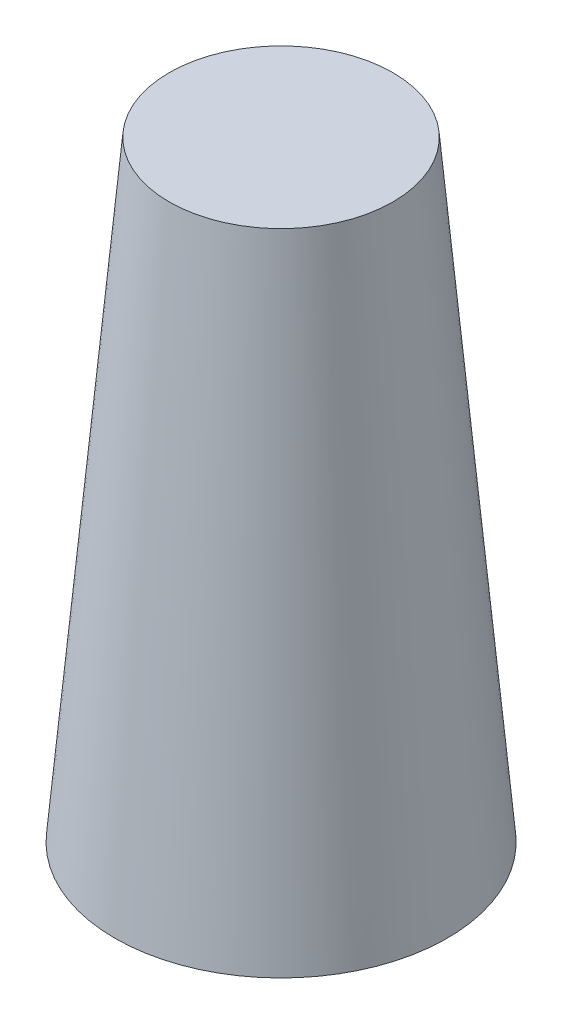
ISO-10303-21;
HEADER;
FILE_DESCRIPTION(('STEP AP214'),'2;1');
FILE_NAME('part.step','',(''),(''),'','','');
FILE_SCHEMA(('AUTOMOTIVE_DESIGN { 1 0 10303 214 1 1 1 1 }'));
ENDSEC;
DATA;
#1=APPLICATION_CONTEXT('core data for automotive mechanical design processes');
#2=APPLICATION_PROTOCOL_DEFINITION('international standard','automotive_design',2000,#1);
#3=PRODUCT_CONTEXT('',#1,'mechanical');
#4=PRODUCT('Part','Part','',(#3));
#5=PRODUCT_RELATED_PRODUCT_CATEGORY('part','',(#4));
#6=PRODUCT_DEFINITION_FORMATION('','',#4);
#7=PRODUCT_DEFINITION_CONTEXT('part definition',#1,'design');
#8=PRODUCT_DEFINITION('design','',#6,#7);
#9=PRODUCT_DEFINITION_SHAPE('','',#8);
#10=(LENGTH_UNIT() NAMED_UNIT(*) SI_UNIT(.MILLI.,.METRE.));
#11=(NAMED_UNIT(*) PLANE_ANGLE_UNIT() SI_UNIT($,.RADIAN.));
#12=(NAMED_UNIT(*) SI_UNIT($,.STERADIAN.) SOLID_ANGLE_UNIT());
#13=UNCERTAINTY_MEASURE_WITH_UNIT(LENGTH_MEASURE(1.E-05),#10,'distance_accuracy_value','');
#14=(GEOMETRIC_REPRESENTATION_CONTEXT(3) GLOBAL_UNCERTAINTY_ASSIGNED_CONTEXT((#13)) GLOBAL_UNIT_ASSIGNED_CONTEXT((#10,
#11,#12)) REPRESENTATION_CONTEXT('',''));
#15=CARTESIAN_POINT('',(0.,0.,0.));
#16=DIRECTION('',(0.,0.,1.));
#17=DIRECTION('',(1.,0.,0.));
#18=AXIS2_PLACEMENT_3D('',#15,#16,#17);
#19=CARTESIAN_POINT('',(0.,0.,0.));
#20=DIRECTION('',(0.,1.,0.));
#21=DIRECTION('',(0.,0.,1.));
#22=AXIS2_PLACEMENT_3D('',#19,#20,#21);
#23=PLANE('',#22);
#24=CARTESIAN_POINT('',(0.,0.,0.));
#25=DIRECTION('',(0.,1.,0.));
#26=DIRECTION('',(0.,0.,1.));
#27=AXIS2_PLACEMENT_3D('',#24,#25,#26);
#28=CIRCLE('',#27,6.223);
#29=CARTESIAN_POINT('',(0.,0.,6.223));
#30=VERTEX_POINT('',#29);
#31=EDGE_CURVE('E45',#30,#30,#28,.T.);
#32=ORIENTED_EDGE('',*,*,#31,.F.);
#33=EDGE_LOOP('',(#32));
#34=FACE_BOUND('',#33,.T.);
#35=ADVANCED_FACE('F37',(#34),#23,.F.);
#36=CARTESIAN_POINT('',(0.,22.86,0.));
#37=DIRECTION('',(0.,1.,0.));
#38=DIRECTION('',(0.,0.,1.));
#39=AXIS2_PLACEMENT_3D('',#36,#37,#38);
#40=PLANE('',#39);
#41=CARTESIAN_POINT('',(0.,22.86,0.));
#42=DIRECTION('',(0.,1.,0.));
#43=DIRECTION('',(0.,0.,1.));
#44=AXIS2_PLACEMENT_3D('',#41,#42,#43);
#45=CIRCLE('',#44,4.191);
#46=CARTESIAN_POINT('',(0.,22.86,4.191));
#47=VERTEX_POINT('',#46);
#48=EDGE_CURVE('E11',#47,#47,#45,.T.);
#49=ORIENTED_EDGE('',*,*,#48,.T.);
#50=EDGE_LOOP('',(#49));
#51=FACE_BOUND('',#50,.T.);
#52=ADVANCED_FACE('F85',(#51),#40,.T.);
#53=CARTESIAN_POINT('',(0.,22.86,0.));
#54=DIRECTION('',(0.,-1.,0.));
#55=DIRECTION('',(0.,0.,-1.));
#56=AXIS2_PLACEMENT_3D('',#53,#54,#55);
#57=CONICAL_SURFACE('',#56,4.191,0.0886558818674374);
#58=ORIENTED_EDGE('',*,*,#48,.F.);
#59=EDGE_LOOP('',(#58));
#60=FACE_BOUND('',#59,.T.);
#61=ORIENTED_EDGE('',*,*,#31,.T.);
#62=EDGE_LOOP('',(#61));
#63=FACE_BOUND('',#62,.T.);
#64=ADVANCED_FACE('F70',(#60,#63),#57,.T.);
#65=CLOSED_SHELL('',(#35,#52,#64));
#66=MANIFOLD_SOLID_BREP('B2',#65);
#67=ADVANCED_BREP_SHAPE_REPRESENTATION('',(#18,#66),#14);
#68=SHAPE_DEFINITION_REPRESENTATION(#9,#67);
ENDSEC;
END-ISO-10303-21;
